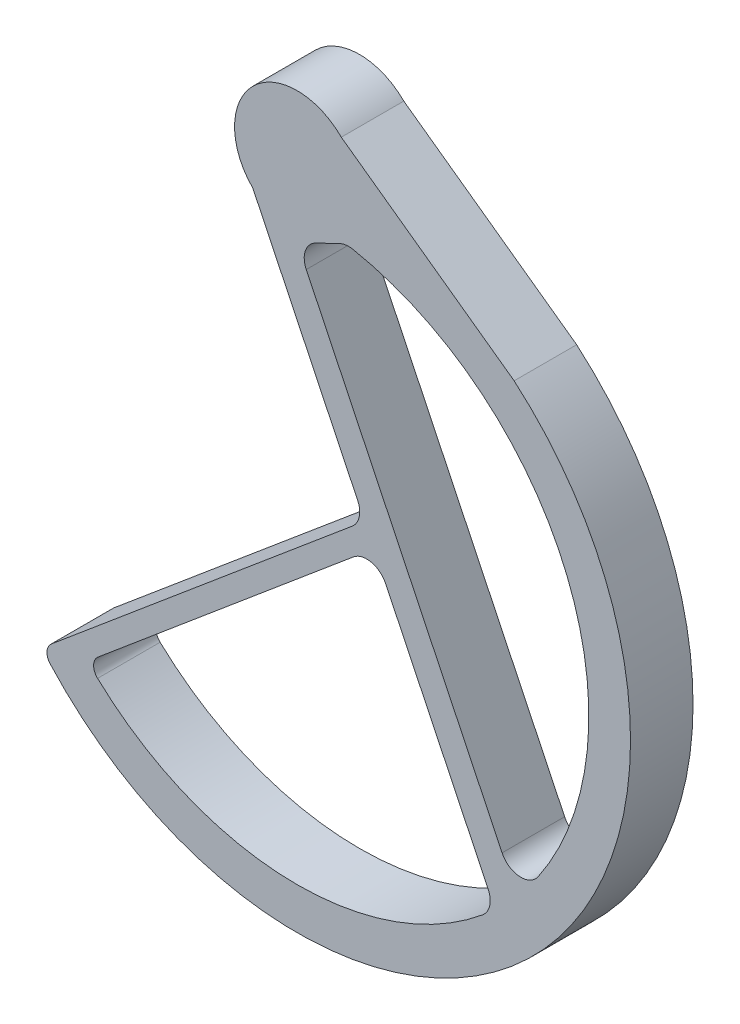
ISO-10303-21;
HEADER;
FILE_DESCRIPTION(('STEP AP214'),'2;1');
FILE_NAME('part.step','',(''),(''),'','','');
FILE_SCHEMA(('AUTOMOTIVE_DESIGN { 1 0 10303 214 1 1 1 1 }'));
ENDSEC;
DATA;
#1=APPLICATION_CONTEXT('core data for automotive mechanical design processes');
#2=APPLICATION_PROTOCOL_DEFINITION('international standard','automotive_design',2000,#1);
#3=PRODUCT_CONTEXT('',#1,'mechanical');
#4=PRODUCT('Part','Part','',(#3));
#5=PRODUCT_RELATED_PRODUCT_CATEGORY('part','',(#4));
#6=PRODUCT_DEFINITION_FORMATION('','',#4);
#7=PRODUCT_DEFINITION_CONTEXT('part definition',#1,'design');
#8=PRODUCT_DEFINITION('design','',#6,#7);
#9=PRODUCT_DEFINITION_SHAPE('','',#8);
#10=(LENGTH_UNIT() NAMED_UNIT(*) SI_UNIT(.MILLI.,.METRE.));
#11=(NAMED_UNIT(*) PLANE_ANGLE_UNIT() SI_UNIT($,.RADIAN.));
#12=(NAMED_UNIT(*) SI_UNIT($,.STERADIAN.) SOLID_ANGLE_UNIT());
#13=UNCERTAINTY_MEASURE_WITH_UNIT(LENGTH_MEASURE(1.E-05),#10,'distance_accuracy_value','');
#14=(GEOMETRIC_REPRESENTATION_CONTEXT(3) GLOBAL_UNCERTAINTY_ASSIGNED_CONTEXT((#13)) GLOBAL_UNIT_ASSIGNED_CONTEXT((#10,
#11,#12)) REPRESENTATION_CONTEXT('',''));
#15=CARTESIAN_POINT('',(0.,0.,0.));
#16=DIRECTION('',(0.,0.,1.));
#17=DIRECTION('',(1.,0.,0.));
#18=AXIS2_PLACEMENT_3D('',#15,#16,#17);
#19=CARTESIAN_POINT('',(-12.7570586950624,-6.1348621133076,15.));
#20=DIRECTION('',(0.901206602628173,0.433389731511241,0.));
#21=DIRECTION('',(-0.433389731511241,0.901206602628173,0.));
#22=AXIS2_PLACEMENT_3D('',#19,#20,#21);
#23=PLANE('',#22);
#24=DIRECTION('',(0.433389731511241,-0.901206602628173,0.));
#25=VECTOR('',#24,1.);
#26=CARTESIAN_POINT('',(-12.7570586950624,-6.1348621133076,0.));
#27=LINE('',#26,#25);
#28=CARTESIAN_POINT('',(21.2324006956412,-76.8137984043253,0.));
#29=VERTEX_POINT('',#28);
#30=CARTESIAN_POINT('',(45.844843506453,-127.9938203457,0.));
#31=VERTEX_POINT('',#30);
#32=EDGE_CURVE('E279',#29,#31,#27,.T.);
#33=ORIENTED_EDGE('',*,*,#32,.T.);
#34=DIRECTION('',(0.,0.,-1.));
#35=VECTOR('',#34,1.);
#36=CARTESIAN_POINT('',(45.844843506453,-127.9938203457,15.));
#37=LINE('',#36,#35);
#38=CARTESIAN_POINT('',(45.844843506453,-127.9938203457,15.));
#39=VERTEX_POINT('',#38);
#40=EDGE_CURVE('E11',#39,#31,#37,.T.);
#41=ORIENTED_EDGE('',*,*,#40,.F.);
#42=DIRECTION('',(0.433389731511241,-0.901206602628173,0.));
#43=VECTOR('',#42,1.);
#44=CARTESIAN_POINT('',(-12.7570586950624,-6.1348621133076,15.));
#45=LINE('',#44,#43);
#46=CARTESIAN_POINT('',(21.2324006956412,-76.8137984043253,15.));
#47=VERTEX_POINT('',#46);
#48=EDGE_CURVE('E245',#47,#39,#45,.T.);
#49=ORIENTED_EDGE('',*,*,#48,.F.);
#50=DIRECTION('',(0.,0.,-1.));
#51=VECTOR('',#50,1.);
#52=CARTESIAN_POINT('',(21.2324006956412,-76.8137984043253,15.));
#53=LINE('',#52,#51);
#54=EDGE_CURVE('E293',#47,#29,#53,.T.);
#55=ORIENTED_EDGE('',*,*,#54,.T.);
#56=EDGE_LOOP('',(#33,#41,#49,#55));
#57=FACE_BOUND('',#56,.T.);
#58=ADVANCED_FACE('F36',(#57),#23,.F.);
#59=CARTESIAN_POINT('',(41.3388104933121,-130.160769003256,15.));
#60=DIRECTION('',(0.,0.,-1.));
#61=DIRECTION('',(-1.,0.,0.));
#62=AXIS2_PLACEMENT_3D('',#59,#60,#61);
#63=CYLINDRICAL_SURFACE('',#62,4.99999999999999);
#64=CARTESIAN_POINT('',(41.3388104933121,-130.160769003256,0.));
#65=DIRECTION('',(0.,0.,1.));
#66=DIRECTION('',(1.,0.,0.));
#67=AXIS2_PLACEMENT_3D('',#64,#65,#66);
#68=CIRCLE('',#67,4.99999999999999);
#69=CARTESIAN_POINT('',(44.5187189927976,-134.019289695814,0.));
#70=VERTEX_POINT('',#69);
#71=EDGE_CURVE('E282',#31,#70,#68,.F.);
#72=ORIENTED_EDGE('',*,*,#71,.T.);
#73=DIRECTION('',(0.,0.,-1.));
#74=VECTOR('',#73,1.);
#75=CARTESIAN_POINT('',(44.5187189927976,-134.019289695814,15.));
#76=LINE('',#75,#74);
#77=CARTESIAN_POINT('',(44.5187189927976,-134.019289695814,15.));
#78=VERTEX_POINT('',#77);
#79=EDGE_CURVE('E45',#78,#70,#76,.T.);
#80=ORIENTED_EDGE('',*,*,#79,.F.);
#81=CARTESIAN_POINT('',(41.3388104933121,-130.160769003256,15.));
#82=DIRECTION('',(0.,0.,1.));
#83=DIRECTION('',(1.,0.,0.));
#84=AXIS2_PLACEMENT_3D('',#81,#82,#83);
#85=CIRCLE('',#84,4.99999999999999);
#86=EDGE_CURVE('E248',#39,#78,#85,.F.);
#87=ORIENTED_EDGE('',*,*,#86,.F.);
#88=ORIENTED_EDGE('',*,*,#40,.T.);
#89=EDGE_LOOP('',(#72,#80,#87,#88));
#90=FACE_BOUND('',#89,.T.);
#91=ADVANCED_FACE('F359',(#90),#63,.F.);
#92=CARTESIAN_POINT('',(0.,-80.,15.));
#93=DIRECTION('',(0.,0.,-1.));
#94=DIRECTION('',(-1.,0.,0.));
#95=AXIS2_PLACEMENT_3D('',#92,#93,#94);
#96=CYLINDRICAL_SURFACE('',#95,70.);
#97=CARTESIAN_POINT('',(0.,-80.,0.));
#98=DIRECTION('',(0.,0.,1.));
#99=DIRECTION('',(1.,0.,0.));
#100=AXIS2_PLACEMENT_3D('',#97,#98,#99);
#101=CIRCLE('',#100,70.);
#102=CARTESIAN_POINT('',(-47.870174388264,-131.072951785042,0.));
#103=VERTEX_POINT('',#102);
#104=EDGE_CURVE('E285',#103,#70,#101,.T.);
#105=ORIENTED_EDGE('',*,*,#104,.F.);
#106=DIRECTION('',(0.,0.,-1.));
#107=VECTOR('',#106,1.);
#108=CARTESIAN_POINT('',(-47.870174388264,-131.072951785042,15.));
#109=LINE('',#108,#107);
#110=CARTESIAN_POINT('',(-47.870174388264,-131.072951785042,15.));
#111=VERTEX_POINT('',#110);
#112=EDGE_CURVE('E302',#111,#103,#109,.T.);
#113=ORIENTED_EDGE('',*,*,#112,.F.);
#114=CARTESIAN_POINT('',(0.,-80.,15.));
#115=DIRECTION('',(0.,0.,1.));
#116=DIRECTION('',(1.,0.,0.));
#117=AXIS2_PLACEMENT_3D('',#114,#115,#116);
#118=CIRCLE('',#117,70.);
#119=EDGE_CURVE('E250',#111,#78,#118,.T.);
#120=ORIENTED_EDGE('',*,*,#119,.T.);
#121=ORIENTED_EDGE('',*,*,#79,.T.);
#122=EDGE_LOOP('',(#105,#113,#120,#121));
#123=FACE_BOUND('',#122,.T.);
#124=ADVANCED_FACE('F365',(#123),#96,.F.);
#125=CARTESIAN_POINT('',(-45.8185954859101,-128.884110994254,15.));
#126=DIRECTION('',(0.,0.,-1.));
#127=DIRECTION('',(-1.,0.,0.));
#128=AXIS2_PLACEMENT_3D('',#125,#126,#127);
#129=CYLINDRICAL_SURFACE('',#128,2.99999999999979);
#130=CARTESIAN_POINT('',(-45.8185954859101,-128.884110994254,0.));
#131=DIRECTION('',(0.,0.,1.));
#132=DIRECTION('',(1.,0.,0.));
#133=AXIS2_PLACEMENT_3D('',#130,#131,#132);
#134=CIRCLE('',#133,2.99999999999979);
#135=CARTESIAN_POINT('',(-47.7476784165524,-126.586582094174,0.));
#136=VERTEX_POINT('',#135);
#137=EDGE_CURVE('E288',#103,#136,#134,.F.);
#138=ORIENTED_EDGE('',*,*,#137,.T.);
#139=DIRECTION('',(0.,0.,-1.));
#140=VECTOR('',#139,1.);
#141=CARTESIAN_POINT('',(-47.7476784165524,-126.586582094174,15.));
#142=LINE('',#141,#140);
#143=CARTESIAN_POINT('',(-47.7476784165524,-126.586582094174,15.));
#144=VERTEX_POINT('',#143);
#145=EDGE_CURVE('E299',#144,#136,#142,.T.);
#146=ORIENTED_EDGE('',*,*,#145,.F.);
#147=CARTESIAN_POINT('',(-45.8185954859101,-128.884110994254,15.));
#148=DIRECTION('',(0.,0.,1.));
#149=DIRECTION('',(1.,0.,0.));
#150=AXIS2_PLACEMENT_3D('',#147,#148,#149);
#151=CIRCLE('',#150,2.99999999999979);
#152=EDGE_CURVE('E253',#111,#144,#151,.F.);
#153=ORIENTED_EDGE('',*,*,#152,.F.);
#154=ORIENTED_EDGE('',*,*,#112,.T.);
#155=EDGE_LOOP('',(#138,#146,#153,#154));
#156=FACE_BOUND('',#155,.T.);
#157=ADVANCED_FACE('F371',(#156),#129,.F.);
#158=CARTESIAN_POINT('',(42.5956727933285,-50.7312504333006,15.));
#159=DIRECTION('',(-0.643027643547508,0.765842966693394,0.));
#160=DIRECTION('',(-0.765842966693394,-0.643027643547508,0.));
#161=AXIS2_PLACEMENT_3D('',#158,#159,#160);
#162=PLANE('',#161);
#163=DIRECTION('',(0.765842966693394,0.643027643547508,0.));
#164=VECTOR('',#163,1.);
#165=CARTESIAN_POINT('',(42.5956727933285,-50.7312504333006,0.));
#166=LINE('',#165,#164);
#167=CARTESIAN_POINT('',(13.5112294647628,-75.1515322284145,0.));
#168=VERTEX_POINT('',#167);
#169=EDGE_CURVE('E290',#136,#168,#166,.T.);
#170=ORIENTED_EDGE('',*,*,#169,.T.);
#171=DIRECTION('',(0.,0.,-1.));
#172=VECTOR('',#171,1.);
#173=CARTESIAN_POINT('',(13.5112294647628,-75.1515322284145,15.));
#174=LINE('',#173,#172);
#175=CARTESIAN_POINT('',(13.5112294647628,-75.1515322284145,15.));
#176=VERTEX_POINT('',#175);
#177=EDGE_CURVE('E296',#176,#168,#174,.T.);
#178=ORIENTED_EDGE('',*,*,#177,.F.);
#179=DIRECTION('',(0.765842966693394,0.643027643547508,0.));
#180=VECTOR('',#179,1.);
#181=CARTESIAN_POINT('',(42.5956727933285,-50.7312504333006,15.));
#182=LINE('',#181,#180);
#183=EDGE_CURVE('E255',#144,#176,#182,.T.);
#184=ORIENTED_EDGE('',*,*,#183,.F.);
#185=ORIENTED_EDGE('',*,*,#145,.T.);
#186=EDGE_LOOP('',(#170,#178,#184,#185));
#187=FACE_BOUND('',#186,.T.);
#188=ADVANCED_FACE('F375',(#187),#162,.F.);
#189=CARTESIAN_POINT('',(10.0302471408598,-65.0565868768263,15.));
#190=DIRECTION('',(0.,0.,-1.));
#191=DIRECTION('',(-1.,0.,0.));
#192=AXIS2_PLACEMENT_3D('',#189,#190,#191);
#193=CYLINDRICAL_SURFACE('',#192,5.);
#194=CARTESIAN_POINT('',(10.0302471408598,-65.0565868768263,0.));
#195=DIRECTION('',(0.,0.,1.));
#196=DIRECTION('',(1.,0.,0.));
#197=AXIS2_PLACEMENT_3D('',#194,#195,#196);
#198=CIRCLE('',#197,5.);
#199=CARTESIAN_POINT('',(13.2441851892925,-68.8868090924212,0.));
#200=VERTEX_POINT('',#199);
#201=CARTESIAN_POINT('',(14.5362801540007,-62.8896382192701,0.));
#202=VERTEX_POINT('',#201);
#203=EDGE_CURVE('E218',#200,#202,#198,.T.);
#204=ORIENTED_EDGE('',*,*,#203,.F.);
#205=DIRECTION('',(0.,0.,-1.));
#206=VECTOR('',#205,1.);
#207=CARTESIAN_POINT('',(13.2441851892925,-68.8868090924212,15.));
#208=LINE('',#207,#206);
#209=CARTESIAN_POINT('',(13.2441851892925,-68.8868090924212,15.));
#210=VERTEX_POINT('',#209);
#211=EDGE_CURVE('E40',#210,#200,#208,.T.);
#212=ORIENTED_EDGE('',*,*,#211,.F.);
#213=CARTESIAN_POINT('',(10.0302471408598,-65.0565868768263,15.));
#214=DIRECTION('',(0.,0.,1.));
#215=DIRECTION('',(1.,0.,0.));
#216=AXIS2_PLACEMENT_3D('',#213,#214,#215);
#217=CIRCLE('',#216,5.);
#218=CARTESIAN_POINT('',(14.5362801540007,-62.8896382192701,15.));
#219=VERTEX_POINT('',#218);
#220=EDGE_CURVE('E226',#210,#219,#217,.T.);
#221=ORIENTED_EDGE('',*,*,#220,.T.);
#222=DIRECTION('',(0.,0.,-1.));
#223=VECTOR('',#222,1.);
#224=CARTESIAN_POINT('',(14.5362801540007,-62.8896382192701,15.));
#225=LINE('',#224,#223);
#226=EDGE_CURVE('E259',#219,#202,#225,.T.);
#227=ORIENTED_EDGE('',*,*,#226,.T.);
#228=EDGE_LOOP('',(#204,#212,#221,#227));
#229=FACE_BOUND('',#228,.T.);
#230=ADVANCED_FACE('F38',(#229),#193,.F.);
#231=CARTESIAN_POINT('',(39.3923101204882,-46.9459271066778,15.));
#232=DIRECTION('',(-0.642787609686534,0.766044443118983,0.));
#233=DIRECTION('',(-0.766044443118982,-0.642787609686534,0.));
#234=AXIS2_PLACEMENT_3D('',#231,#232,#233);
#235=PLANE('',#234);
#236=DIRECTION('',(0.766044443118982,0.642787609686534,0.));
#237=VECTOR('',#236,1.);
#238=CARTESIAN_POINT('',(39.3923101204882,-46.9459271066778,0.));
#239=LINE('',#238,#237);
#240=CARTESIAN_POINT('',(-58.9406362868111,-129.457066169617,0.));
#241=VERTEX_POINT('',#240);
#242=EDGE_CURVE('E262',#241,#200,#239,.T.);
#243=ORIENTED_EDGE('',*,*,#242,.F.);
#244=DIRECTION('',(0.,0.,-1.));
#245=VECTOR('',#244,1.);
#246=CARTESIAN_POINT('',(-58.9406362868111,-129.457066169617,15.));
#247=LINE('',#246,#245);
#248=CARTESIAN_POINT('',(-58.9406362868111,-129.457066169617,15.));
#249=VERTEX_POINT('',#248);
#250=EDGE_CURVE('E314',#249,#241,#247,.T.);
#251=ORIENTED_EDGE('',*,*,#250,.F.);
#252=DIRECTION('',(0.766044443118982,0.642787609686534,0.));
#253=VECTOR('',#252,1.);
#254=CARTESIAN_POINT('',(39.3923101204882,-46.9459271066778,15.));
#255=LINE('',#254,#253);
#256=EDGE_CURVE('E229',#249,#210,#255,.T.);
#257=ORIENTED_EDGE('',*,*,#256,.T.);
#258=ORIENTED_EDGE('',*,*,#211,.T.);
#259=EDGE_LOOP('',(#243,#251,#257,#258));
#260=FACE_BOUND('',#259,.T.);
#261=ADVANCED_FACE('F320',(#260),#235,.T.);
#262=CARTESIAN_POINT('',(-57.0122734577518,-131.755199498973,15.));
#263=DIRECTION('',(0.,0.,-1.));
#264=DIRECTION('',(-1.,0.,0.));
#265=AXIS2_PLACEMENT_3D('',#262,#263,#264);
#266=CYLINDRICAL_SURFACE('',#265,2.99999999999976);
#267=CARTESIAN_POINT('',(-57.0122734577518,-131.755199498973,0.));
#268=DIRECTION('',(0.,0.,1.));
#269=DIRECTION('',(1.,0.,0.));
#270=AXIS2_PLACEMENT_3D('',#267,#268,#269);
#271=CIRCLE('',#270,2.99999999999976);
#272=CARTESIAN_POINT('',(-59.2335308651964,-133.771635843089,0.));
#273=VERTEX_POINT('',#272);
#274=EDGE_CURVE('E265',#273,#241,#271,.F.);
#275=ORIENTED_EDGE('',*,*,#274,.F.);
#276=DIRECTION('',(0.,0.,-1.));
#277=VECTOR('',#276,1.);
#278=CARTESIAN_POINT('',(-59.2335308651964,-133.771635843089,15.));
#279=LINE('',#278,#277);
#280=CARTESIAN_POINT('',(-59.2335308651964,-133.771635843089,15.));
#281=VERTEX_POINT('',#280);
#282=EDGE_CURVE('E313',#281,#273,#279,.T.);
#283=ORIENTED_EDGE('',*,*,#282,.F.);
#284=CARTESIAN_POINT('',(-57.0122734577518,-131.755199498973,15.));
#285=DIRECTION('',(0.,0.,1.));
#286=DIRECTION('',(1.,0.,0.));
#287=AXIS2_PLACEMENT_3D('',#284,#285,#286);
#288=CIRCLE('',#287,2.99999999999976);
#289=EDGE_CURVE('E233',#281,#249,#288,.F.);
#290=ORIENTED_EDGE('',*,*,#289,.T.);
#291=ORIENTED_EDGE('',*,*,#250,.T.);
#292=EDGE_LOOP('',(#275,#283,#290,#291));
#293=FACE_BOUND('',#292,.T.);
#294=ADVANCED_FACE('F328',(#293),#266,.T.);
#295=CARTESIAN_POINT('',(0.,-80.,15.));
#296=DIRECTION('',(0.,0.,-1.));
#297=DIRECTION('',(-1.,0.,0.));
#298=AXIS2_PLACEMENT_3D('',#295,#296,#297);
#299=CYLINDRICAL_SURFACE('',#298,80.);
#300=CARTESIAN_POINT('',(0.,-80.,0.));
#301=DIRECTION('',(0.,0.,1.));
#302=DIRECTION('',(1.,0.,0.));
#303=AXIS2_PLACEMENT_3D('',#300,#301,#302);
#304=CIRCLE('',#303,80.);
#305=CARTESIAN_POINT('',(52.0761789176773,-19.2705047828153,0.));
#306=VERTEX_POINT('',#305);
#307=EDGE_CURVE('E268',#273,#306,#304,.T.);
#308=ORIENTED_EDGE('',*,*,#307,.T.);
#309=DIRECTION('',(0.,0.,-1.));
#310=VECTOR('',#309,1.);
#311=CARTESIAN_POINT('',(52.0761789176773,-19.2705047828153,15.));
#312=LINE('',#311,#310);
#313=CARTESIAN_POINT('',(52.0761789176773,-19.2705047828153,15.));
#314=VERTEX_POINT('',#313);
#315=EDGE_CURVE('E311',#314,#306,#312,.T.);
#316=ORIENTED_EDGE('',*,*,#315,.F.);
#317=CARTESIAN_POINT('',(0.,-80.,15.));
#318=DIRECTION('',(0.,0.,1.));
#319=DIRECTION('',(1.,0.,0.));
#320=AXIS2_PLACEMENT_3D('',#317,#318,#319);
#321=CIRCLE('',#320,80.);
#322=EDGE_CURVE('E236',#281,#314,#321,.T.);
#323=ORIENTED_EDGE('',*,*,#322,.F.);
#324=ORIENTED_EDGE('',*,*,#282,.T.);
#325=EDGE_LOOP('',(#308,#316,#323,#324));
#326=FACE_BOUND('',#325,.T.);
#327=ADVANCED_FACE('F333',(#326),#299,.T.);
#328=CARTESIAN_POINT('',(8.65474635415258,12.0128323695446,15.));
#329=DIRECTION('',(0.584549661802916,0.811357931424902,0.));
#330=DIRECTION('',(-0.811357931424902,0.584549661802916,0.));
#331=AXIS2_PLACEMENT_3D('',#328,#329,#330);
#332=PLANE('',#331);
#333=DIRECTION('',(0.811357931424902,-0.584549661802916,0.));
#334=VECTOR('',#333,1.);
#335=CARTESIAN_POINT('',(8.65474635415258,12.0128323695446,0.));
#336=LINE('',#335,#334);
#337=CARTESIAN_POINT('',(10.6066017177981,10.6066017177983,0.));
#338=VERTEX_POINT('',#337);
#339=EDGE_CURVE('E271',#338,#306,#336,.T.);
#340=ORIENTED_EDGE('',*,*,#339,.F.);
#341=DIRECTION('',(0.,0.,-1.));
#342=VECTOR('',#341,1.);
#343=CARTESIAN_POINT('',(10.6066017177981,10.6066017177983,15.));
#344=LINE('',#343,#342);
#345=CARTESIAN_POINT('',(10.6066017177981,10.6066017177983,15.));
#346=VERTEX_POINT('',#345);
#347=EDGE_CURVE('E309',#346,#338,#344,.T.);
#348=ORIENTED_EDGE('',*,*,#347,.F.);
#349=DIRECTION('',(0.811357931424902,-0.584549661802916,0.));
#350=VECTOR('',#349,1.);
#351=CARTESIAN_POINT('',(8.65474635415258,12.0128323695446,15.));
#352=LINE('',#351,#350);
#353=EDGE_CURVE('E238',#346,#314,#352,.T.);
#354=ORIENTED_EDGE('',*,*,#353,.T.);
#355=ORIENTED_EDGE('',*,*,#315,.T.);
#356=EDGE_LOOP('',(#340,#348,#354,#355));
#357=FACE_BOUND('',#356,.T.);
#358=ADVANCED_FACE('F347',(#357),#332,.T.);
#359=CARTESIAN_POINT('',(0.,0.,15.));
#360=DIRECTION('',(0.,0.,-1.));
#361=DIRECTION('',(-1.,0.,0.));
#362=AXIS2_PLACEMENT_3D('',#359,#360,#361);
#363=CYLINDRICAL_SURFACE('',#362,15.);
#364=CARTESIAN_POINT('',(0.,0.,0.));
#365=DIRECTION('',(0.,0.,1.));
#366=DIRECTION('',(1.,0.,0.));
#367=AXIS2_PLACEMENT_3D('',#364,#365,#366);
#368=CIRCLE('',#367,15.);
#369=CARTESIAN_POINT('',(-10.6066017177981,-10.6066017177983,0.));
#370=VERTEX_POINT('',#369);
#371=EDGE_CURVE('E274',#338,#370,#368,.T.);
#372=ORIENTED_EDGE('',*,*,#371,.T.);
#373=DIRECTION('',(0.,0.,-1.));
#374=VECTOR('',#373,1.);
#375=CARTESIAN_POINT('',(-10.6066017177981,-10.6066017177983,15.));
#376=LINE('',#375,#374);
#377=CARTESIAN_POINT('',(-10.6066017177981,-10.6066017177983,15.));
#378=VERTEX_POINT('',#377);
#379=EDGE_CURVE('E306',#378,#370,#376,.T.);
#380=ORIENTED_EDGE('',*,*,#379,.F.);
#381=CARTESIAN_POINT('',(0.,0.,15.));
#382=DIRECTION('',(0.,0.,1.));
#383=DIRECTION('',(1.,0.,0.));
#384=AXIS2_PLACEMENT_3D('',#381,#382,#383);
#385=CIRCLE('',#384,15.);
#386=EDGE_CURVE('E241',#346,#378,#385,.T.);
#387=ORIENTED_EDGE('',*,*,#386,.F.);
#388=ORIENTED_EDGE('',*,*,#347,.T.);
#389=EDGE_LOOP('',(#372,#380,#387,#388));
#390=FACE_BOUND('',#389,.T.);
#391=ADVANCED_FACE('F348',(#390),#363,.T.);
#392=CARTESIAN_POINT('',(-12.7570586950624,-6.13486211330761,15.));
#393=DIRECTION('',(0.901206602628173,0.433389731511242,0.));
#394=DIRECTION('',(-0.433389731511242,0.901206602628173,0.));
#395=AXIS2_PLACEMENT_3D('',#392,#393,#394);
#396=PLANE('',#395);
#397=DIRECTION('',(0.433389731511242,-0.901206602628173,0.));
#398=VECTOR('',#397,1.);
#399=CARTESIAN_POINT('',(-12.7570586950624,-6.13486211330761,0.));
#400=LINE('',#399,#398);
#401=EDGE_CURVE('E276',#370,#202,#400,.T.);
#402=ORIENTED_EDGE('',*,*,#401,.T.);
#403=ORIENTED_EDGE('',*,*,#226,.F.);
#404=DIRECTION('',(0.433389731511242,-0.901206602628173,0.));
#405=VECTOR('',#404,1.);
#406=CARTESIAN_POINT('',(-12.7570586950624,-6.13486211330761,15.));
#407=LINE('',#406,#405);
#408=EDGE_CURVE('E243',#378,#219,#407,.T.);
#409=ORIENTED_EDGE('',*,*,#408,.F.);
#410=ORIENTED_EDGE('',*,*,#379,.T.);
#411=EDGE_LOOP('',(#402,#403,#409,#410));
#412=FACE_BOUND('',#411,.T.);
#413=ADVANCED_FACE('F342',(#412),#396,.F.);
#414=CARTESIAN_POINT('',(16.7263676825004,-78.9807470618814,15.));
#415=DIRECTION('',(0.,0.,-1.));
#416=DIRECTION('',(-1.,0.,0.));
#417=AXIS2_PLACEMENT_3D('',#414,#415,#416);
#418=CYLINDRICAL_SURFACE('',#417,5.);
#419=CARTESIAN_POINT('',(16.7263676825004,-78.9807470618814,0.));
#420=DIRECTION('',(0.,0.,1.));
#421=DIRECTION('',(1.,0.,0.));
#422=AXIS2_PLACEMENT_3D('',#419,#420,#421);
#423=CIRCLE('',#422,5.);
#424=EDGE_CURVE('E230',#168,#29,#423,.F.);
#425=ORIENTED_EDGE('',*,*,#424,.T.);
#426=ORIENTED_EDGE('',*,*,#54,.F.);
#427=CARTESIAN_POINT('',(16.7263676825004,-78.9807470618814,15.));
#428=DIRECTION('',(0.,0.,1.));
#429=DIRECTION('',(1.,0.,0.));
#430=AXIS2_PLACEMENT_3D('',#427,#428,#429);
#431=CIRCLE('',#430,5.);
#432=EDGE_CURVE('E257',#176,#47,#431,.F.);
#433=ORIENTED_EDGE('',*,*,#432,.F.);
#434=ORIENTED_EDGE('',*,*,#177,.T.);
#435=EDGE_LOOP('',(#425,#426,#433,#434));
#436=FACE_BOUND('',#435,.T.);
#437=ADVANCED_FACE('F355',(#436),#418,.F.);
#438=CARTESIAN_POINT('',(0.,0.,15.));
#439=DIRECTION('',(0.,0.,1.));
#440=DIRECTION('',(1.,0.,0.));
#441=AXIS2_PLACEMENT_3D('',#438,#439,#440);
#442=PLANE('',#441);
#443=CARTESIAN_POINT('',(6.70778479931193,-18.9220720384942,15.));
#444=DIRECTION('',(0.,0.,1.));
#445=DIRECTION('',(-1.,0.,0.));
#446=AXIS2_PLACEMENT_3D('',#443,#444,#445);
#447=CIRCLE('',#446,5.);
#448=CARTESIAN_POINT('',(4.54083614175573,-14.4160390253533,15.));
#449=VERTEX_POINT('',#448);
#450=CARTESIAN_POINT('',(2.20175178617109,-21.0890206960504,15.));
#451=VERTEX_POINT('',#450);
#452=EDGE_CURVE('E53',#449,#451,#447,.T.);
#453=ORIENTED_EDGE('',*,*,#452,.F.);
#454=DIRECTION('',(-0.901206602628171,-0.433389731511247,0.));
#455=VECTOR('',#454,1.);
#456=CARTESIAN_POINT('',(6.4834156052804,-13.4818536901804,15.));
#457=LINE('',#456,#455);
#458=CARTESIAN_POINT('',(10.2196588467731,-11.6850964864837,15.));
#459=VERTEX_POINT('',#458);
#460=EDGE_CURVE('E188',#459,#449,#457,.T.);
#461=ORIENTED_EDGE('',*,*,#460,.F.);
#462=CARTESIAN_POINT('',(12.3866075043293,-16.1911294996245,15.));
#463=DIRECTION('',(0.,0.,1.));
#464=DIRECTION('',(1.,0.,0.));
#465=AXIS2_PLACEMENT_3D('',#462,#463,#464);
#466=CIRCLE('',#465,5.);
#467=CARTESIAN_POINT('',(13.3394234662008,-11.2827548457495,15.));
#468=VERTEX_POINT('',#467);
#469=EDGE_CURVE('E191',#468,#459,#466,.T.);
#470=ORIENTED_EDGE('',*,*,#469,.F.);
#471=CARTESIAN_POINT('',(0.,-80.,15.));
#472=DIRECTION('',(0.,0.,1.));
#473=DIRECTION('',(1.,0.,0.));
#474=AXIS2_PLACEMENT_3D('',#471,#472,#473);
#475=CIRCLE('',#474,69.9999999999999);
#476=CARTESIAN_POINT('',(57.8260553336624,-119.448033215209,15.));
#477=VERTEX_POINT('',#476);
#478=EDGE_CURVE('E211',#477,#468,#475,.T.);
#479=ORIENTED_EDGE('',*,*,#478,.F.);
#480=CARTESIAN_POINT('',(53.6956228098294,-116.63031655698,15.));
#481=DIRECTION('',(0.,0.,1.));
#482=DIRECTION('',(-1.,0.,0.));
#483=AXIS2_PLACEMENT_3D('',#480,#481,#482);
#484=CIRCLE('',#483,5.);
#485=CARTESIAN_POINT('',(49.1895897966885,-118.797265214536,15.));
#486=VERTEX_POINT('',#485);
#487=EDGE_CURVE('E208',#486,#477,#484,.T.);
#488=ORIENTED_EDGE('',*,*,#487,.F.);
#489=DIRECTION('',(0.433389731511244,-0.901206602628172,0.));
#490=VECTOR('',#489,1.);
#491=CARTESIAN_POINT('',(49.1895897966885,-118.797265214536,15.));
#492=LINE('',#491,#490);
#493=EDGE_CURVE('E205',#451,#486,#492,.T.);
#494=ORIENTED_EDGE('',*,*,#493,.F.);
#495=EDGE_LOOP('',(#453,#461,#470,#479,#488,#494));
#496=FACE_BOUND('',#495,.T.);
#497=ORIENTED_EDGE('',*,*,#220,.F.);
#498=ORIENTED_EDGE('',*,*,#256,.F.);
#499=ORIENTED_EDGE('',*,*,#289,.F.);
#500=ORIENTED_EDGE('',*,*,#322,.T.);
#501=ORIENTED_EDGE('',*,*,#353,.F.);
#502=ORIENTED_EDGE('',*,*,#386,.T.);
#503=ORIENTED_EDGE('',*,*,#408,.T.);
#504=EDGE_LOOP('',(#497,#498,#499,#500,#501,#502,#503));
#505=FACE_BOUND('',#504,.T.);
#506=ORIENTED_EDGE('',*,*,#48,.T.);
#507=ORIENTED_EDGE('',*,*,#86,.T.);
#508=ORIENTED_EDGE('',*,*,#119,.F.);
#509=ORIENTED_EDGE('',*,*,#152,.T.);
#510=ORIENTED_EDGE('',*,*,#183,.T.);
#511=ORIENTED_EDGE('',*,*,#432,.T.);
#512=EDGE_LOOP('',(#506,#507,#508,#509,#510,#511));
#513=FACE_BOUND('',#512,.T.);
#514=ADVANCED_FACE('F336',(#496,#505,#513),#442,.T.);
#515=CARTESIAN_POINT('',(0.,0.,0.));
#516=DIRECTION('',(0.,0.,1.));
#517=DIRECTION('',(1.,0.,0.));
#518=AXIS2_PLACEMENT_3D('',#515,#516,#517);
#519=PLANE('',#518);
#520=CARTESIAN_POINT('',(0.,0.,0.));
#521=DIRECTION('',(0.,0.,-1.));
#522=DIRECTION('',(-1.,0.,0.));
#523=AXIS2_PLACEMENT_3D('',#520,#521,#522);
#524=CIRCLE('',#523,10.1);
#525=CARTESIAN_POINT('',(-10.1,0.,0.));
#526=VERTEX_POINT('',#525);
#527=EDGE_CURVE('E194',#526,#526,#524,.T.);
#528=ORIENTED_EDGE('',*,*,#527,.F.);
#529=EDGE_LOOP('',(#528));
#530=FACE_BOUND('',#529,.T.);
#531=DIRECTION('',(-0.90120660262817,-0.433389731511248,0.));
#532=VECTOR('',#531,1.);
#533=CARTESIAN_POINT('',(6.4834156052804,-13.4818536901804,0.));
#534=LINE('',#533,#532);
#535=CARTESIAN_POINT('',(10.2196588467731,-11.6850964864837,0.));
#536=VERTEX_POINT('',#535);
#537=CARTESIAN_POINT('',(4.54083614175573,-14.4160390253533,0.));
#538=VERTEX_POINT('',#537);
#539=EDGE_CURVE('E177',#536,#538,#534,.T.);
#540=ORIENTED_EDGE('',*,*,#539,.T.);
#541=CARTESIAN_POINT('',(6.70778479931193,-18.9220720384942,0.));
#542=DIRECTION('',(0.,0.,1.));
#543=DIRECTION('',(-1.,0.,0.));
#544=AXIS2_PLACEMENT_3D('',#541,#542,#543);
#545=CIRCLE('',#544,5.);
#546=CARTESIAN_POINT('',(2.20175178617109,-21.0890206960504,0.));
#547=VERTEX_POINT('',#546);
#548=EDGE_CURVE('E171',#538,#547,#545,.T.);
#549=ORIENTED_EDGE('',*,*,#548,.T.);
#550=DIRECTION('',(0.433389731511244,-0.901206602628172,0.));
#551=VECTOR('',#550,1.);
#552=CARTESIAN_POINT('',(49.1895897966885,-118.797265214536,0.));
#553=LINE('',#552,#551);
#554=CARTESIAN_POINT('',(49.1895897966885,-118.797265214536,0.));
#555=VERTEX_POINT('',#554);
#556=EDGE_CURVE('E180',#547,#555,#553,.T.);
#557=ORIENTED_EDGE('',*,*,#556,.T.);
#558=CARTESIAN_POINT('',(53.6956228098294,-116.63031655698,0.));
#559=DIRECTION('',(0.,0.,1.));
#560=DIRECTION('',(-1.,0.,0.));
#561=AXIS2_PLACEMENT_3D('',#558,#559,#560);
#562=CIRCLE('',#561,5.);
#563=CARTESIAN_POINT('',(57.8260553336624,-119.448033215209,0.));
#564=VERTEX_POINT('',#563);
#565=EDGE_CURVE('E61',#555,#564,#562,.T.);
#566=ORIENTED_EDGE('',*,*,#565,.T.);
#567=CARTESIAN_POINT('',(0.,-80.,0.));
#568=DIRECTION('',(0.,0.,1.));
#569=DIRECTION('',(1.,0.,0.));
#570=AXIS2_PLACEMENT_3D('',#567,#568,#569);
#571=CIRCLE('',#570,69.9999999999999);
#572=CARTESIAN_POINT('',(13.3394234662008,-11.2827548457495,0.));
#573=VERTEX_POINT('',#572);
#574=EDGE_CURVE('E198',#564,#573,#571,.T.);
#575=ORIENTED_EDGE('',*,*,#574,.T.);
#576=CARTESIAN_POINT('',(12.3866075043293,-16.1911294996245,0.));
#577=DIRECTION('',(0.,0.,1.));
#578=DIRECTION('',(1.,0.,0.));
#579=AXIS2_PLACEMENT_3D('',#576,#577,#578);
#580=CIRCLE('',#579,5.);
#581=EDGE_CURVE('E201',#573,#536,#580,.T.);
#582=ORIENTED_EDGE('',*,*,#581,.T.);
#583=EDGE_LOOP('',(#540,#549,#557,#566,#575,#582));
#584=FACE_BOUND('',#583,.T.);
#585=ORIENTED_EDGE('',*,*,#203,.T.);
#586=ORIENTED_EDGE('',*,*,#401,.F.);
#587=ORIENTED_EDGE('',*,*,#371,.F.);
#588=ORIENTED_EDGE('',*,*,#339,.T.);
#589=ORIENTED_EDGE('',*,*,#307,.F.);
#590=ORIENTED_EDGE('',*,*,#274,.T.);
#591=ORIENTED_EDGE('',*,*,#242,.T.);
#592=EDGE_LOOP('',(#585,#586,#587,#588,#589,#590,#591));
#593=FACE_BOUND('',#592,.T.);
#594=ORIENTED_EDGE('',*,*,#32,.F.);
#595=ORIENTED_EDGE('',*,*,#424,.F.);
#596=ORIENTED_EDGE('',*,*,#169,.F.);
#597=ORIENTED_EDGE('',*,*,#137,.F.);
#598=ORIENTED_EDGE('',*,*,#104,.T.);
#599=ORIENTED_EDGE('',*,*,#71,.F.);
#600=EDGE_LOOP('',(#594,#595,#596,#597,#598,#599));
#601=FACE_BOUND('',#600,.T.);
#602=ADVANCED_FACE('F184',(#530,#584,#593,#601),#519,.F.);
#603=CARTESIAN_POINT('',(6.70778479931193,-18.9220720384942,0.));
#604=DIRECTION('',(0.,0.,1.));
#605=DIRECTION('',(1.,0.,0.));
#606=AXIS2_PLACEMENT_3D('',#603,#604,#605);
#607=CYLINDRICAL_SURFACE('',#606,5.);
#608=ORIENTED_EDGE('',*,*,#452,.T.);
#609=DIRECTION('',(0.,0.,1.));
#610=VECTOR('',#609,1.);
#611=CARTESIAN_POINT('',(2.20175178617109,-21.0890206960504,0.));
#612=LINE('',#611,#610);
#613=EDGE_CURVE('E167',#547,#451,#612,.T.);
#614=ORIENTED_EDGE('',*,*,#613,.F.);
#615=ORIENTED_EDGE('',*,*,#548,.F.);
#616=DIRECTION('',(0.,0.,1.));
#617=VECTOR('',#616,1.);
#618=CARTESIAN_POINT('',(4.54083614175573,-14.4160390253533,0.));
#619=LINE('',#618,#617);
#620=EDGE_CURVE('E216',#538,#449,#619,.T.);
#621=ORIENTED_EDGE('',*,*,#620,.T.);
#622=EDGE_LOOP('',(#608,#614,#615,#621));
#623=FACE_BOUND('',#622,.T.);
#624=ADVANCED_FACE('F169',(#623),#607,.F.);
#625=CARTESIAN_POINT('',(6.4834156052804,-13.4818536901804,0.));
#626=DIRECTION('',(-0.433389731511247,0.901206602628171,0.));
#627=DIRECTION('',(-0.901206602628171,-0.433389731511247,0.));
#628=AXIS2_PLACEMENT_3D('',#625,#626,#627);
#629=PLANE('',#628);
#630=ORIENTED_EDGE('',*,*,#460,.T.);
#631=ORIENTED_EDGE('',*,*,#620,.F.);
#632=ORIENTED_EDGE('',*,*,#539,.F.);
#633=DIRECTION('',(0.,0.,1.));
#634=VECTOR('',#633,1.);
#635=CARTESIAN_POINT('',(10.2196588467731,-11.6850964864837,0.));
#636=LINE('',#635,#634);
#637=EDGE_CURVE('E219',#536,#459,#636,.T.);
#638=ORIENTED_EDGE('',*,*,#637,.T.);
#639=EDGE_LOOP('',(#630,#631,#632,#638));
#640=FACE_BOUND('',#639,.T.);
#641=ADVANCED_FACE('F391',(#640),#629,.F.);
#642=CARTESIAN_POINT('',(12.3866075043293,-16.1911294996245,0.));
#643=DIRECTION('',(0.,0.,1.));
#644=DIRECTION('',(1.,0.,0.));
#645=AXIS2_PLACEMENT_3D('',#642,#643,#644);
#646=CYLINDRICAL_SURFACE('',#645,5.);
#647=ORIENTED_EDGE('',*,*,#469,.T.);
#648=ORIENTED_EDGE('',*,*,#637,.F.);
#649=ORIENTED_EDGE('',*,*,#581,.F.);
#650=DIRECTION('',(0.,0.,1.));
#651=VECTOR('',#650,1.);
#652=CARTESIAN_POINT('',(13.3394234662008,-11.2827548457495,0.));
#653=LINE('',#652,#651);
#654=EDGE_CURVE('E221',#573,#468,#653,.T.);
#655=ORIENTED_EDGE('',*,*,#654,.T.);
#656=EDGE_LOOP('',(#647,#648,#649,#655));
#657=FACE_BOUND('',#656,.T.);
#658=ADVANCED_FACE('F401',(#657),#646,.F.);
#659=CARTESIAN_POINT('',(0.,-80.,0.));
#660=DIRECTION('',(0.,0.,1.));
#661=DIRECTION('',(1.,0.,0.));
#662=AXIS2_PLACEMENT_3D('',#659,#660,#661);
#663=CYLINDRICAL_SURFACE('',#662,69.9999999999999);
#664=ORIENTED_EDGE('',*,*,#478,.T.);
#665=ORIENTED_EDGE('',*,*,#654,.F.);
#666=ORIENTED_EDGE('',*,*,#574,.F.);
#667=DIRECTION('',(0.,0.,1.));
#668=VECTOR('',#667,1.);
#669=CARTESIAN_POINT('',(57.8260553336624,-119.448033215209,0.));
#670=LINE('',#669,#668);
#671=EDGE_CURVE('E223',#564,#477,#670,.T.);
#672=ORIENTED_EDGE('',*,*,#671,.T.);
#673=EDGE_LOOP('',(#664,#665,#666,#672));
#674=FACE_BOUND('',#673,.T.);
#675=ADVANCED_FACE('F398',(#674),#663,.F.);
#676=CARTESIAN_POINT('',(53.6956228098294,-116.63031655698,0.));
#677=DIRECTION('',(0.,0.,1.));
#678=DIRECTION('',(1.,0.,0.));
#679=AXIS2_PLACEMENT_3D('',#676,#677,#678);
#680=CYLINDRICAL_SURFACE('',#679,5.);
#681=ORIENTED_EDGE('',*,*,#487,.T.);
#682=ORIENTED_EDGE('',*,*,#671,.F.);
#683=ORIENTED_EDGE('',*,*,#565,.F.);
#684=DIRECTION('',(0.,0.,1.));
#685=VECTOR('',#684,1.);
#686=CARTESIAN_POINT('',(49.1895897966885,-118.797265214536,0.));
#687=LINE('',#686,#685);
#688=EDGE_CURVE('E176',#555,#486,#687,.T.);
#689=ORIENTED_EDGE('',*,*,#688,.T.);
#690=EDGE_LOOP('',(#681,#682,#683,#689));
#691=FACE_BOUND('',#690,.T.);
#692=ADVANCED_FACE('F395',(#691),#680,.F.);
#693=CARTESIAN_POINT('',(49.1895897966885,-118.797265214536,0.));
#694=DIRECTION('',(-0.901206602628172,-0.433389731511244,0.));
#695=DIRECTION('',(0.433389731511244,-0.901206602628172,0.));
#696=AXIS2_PLACEMENT_3D('',#693,#694,#695);
#697=PLANE('',#696);
#698=ORIENTED_EDGE('',*,*,#493,.T.);
#699=ORIENTED_EDGE('',*,*,#688,.F.);
#700=ORIENTED_EDGE('',*,*,#556,.F.);
#701=ORIENTED_EDGE('',*,*,#613,.T.);
#702=EDGE_LOOP('',(#698,#699,#700,#701));
#703=FACE_BOUND('',#702,.T.);
#704=ADVANCED_FACE('F181',(#703),#697,.F.);
#705=CARTESIAN_POINT('',(0.,0.,2.));
#706=DIRECTION('',(0.,0.,-1.));
#707=DIRECTION('',(-1.,0.,0.));
#708=AXIS2_PLACEMENT_3D('',#705,#706,#707);
#709=CYLINDRICAL_SURFACE('',#708,10.1);
#710=CARTESIAN_POINT('',(0.,0.,2.));
#711=DIRECTION('',(0.,0.,-1.));
#712=DIRECTION('',(-1.,0.,0.));
#713=AXIS2_PLACEMENT_3D('',#710,#711,#712);
#714=CIRCLE('',#713,10.1);
#715=CARTESIAN_POINT('',(-10.1,0.,2.));
#716=VERTEX_POINT('',#715);
#717=EDGE_CURVE('E206',#716,#716,#714,.T.);
#718=ORIENTED_EDGE('',*,*,#717,.F.);
#719=EDGE_LOOP('',(#718));
#720=FACE_BOUND('',#719,.T.);
#721=ORIENTED_EDGE('',*,*,#527,.T.);
#722=EDGE_LOOP('',(#721));
#723=FACE_BOUND('',#722,.T.);
#724=ADVANCED_FACE('F394',(#720,#723),#709,.F.);
#725=CARTESIAN_POINT('',(0.,0.,2.));
#726=DIRECTION('',(0.,0.,-1.));
#727=DIRECTION('',(-1.,0.,0.));
#728=AXIS2_PLACEMENT_3D('',#725,#726,#727);
#729=PLANE('',#728);
#730=ORIENTED_EDGE('',*,*,#717,.T.);
#731=EDGE_LOOP('',(#730));
#732=FACE_BOUND('',#731,.T.);
#733=ADVANCED_FACE('F411',(#732),#729,.T.);
#734=CLOSED_SHELL('',(#58,#91,#124,#157,#188,#230,#261,#294,#327,#358,#391,#413,#437,#514,#602,
#624,#641,#658,#675,#692,#704,#724,#733));
#735=MANIFOLD_SOLID_BREP('B2',#734);
#736=ADVANCED_BREP_SHAPE_REPRESENTATION('',(#18,#735),#14);
#737=SHAPE_DEFINITION_REPRESENTATION(#9,#736);
ENDSEC;
END-ISO-10303-21;
